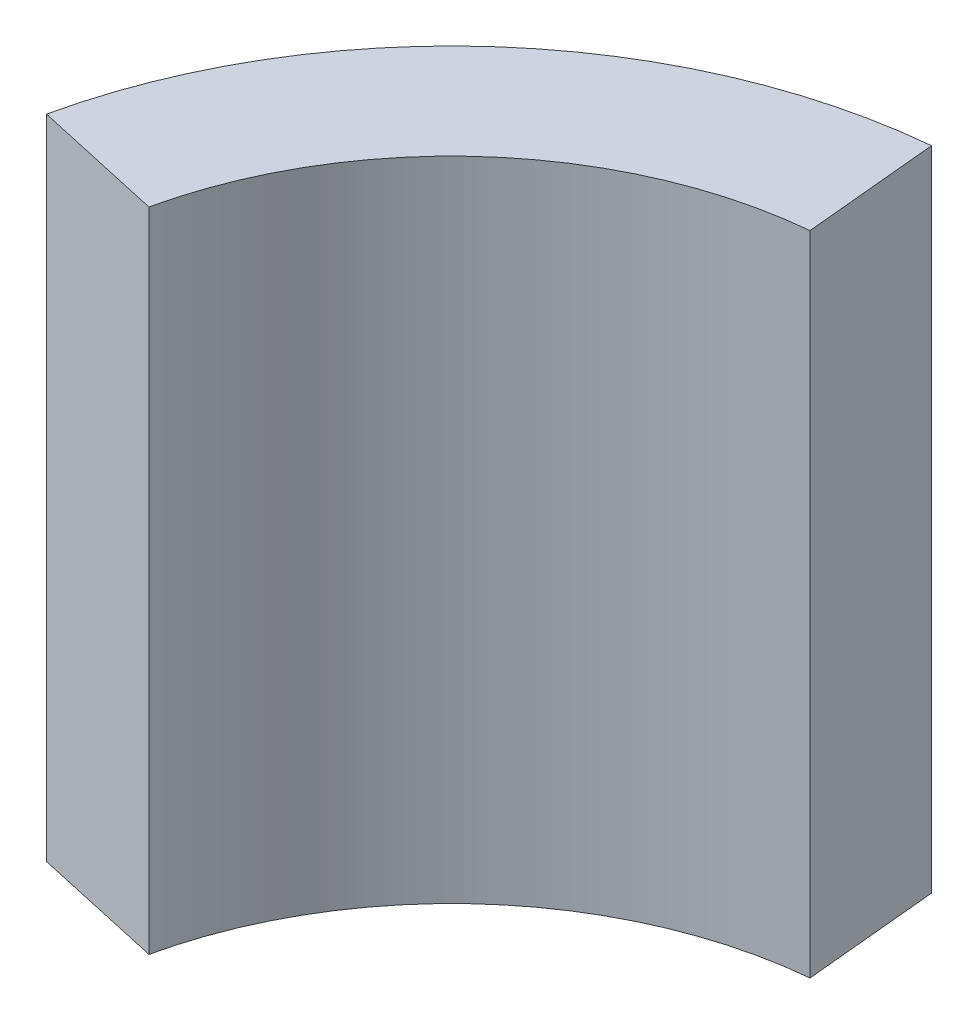
ISO-10303-21;
HEADER;
FILE_DESCRIPTION(('STEP AP214'),'2;1');
FILE_NAME('part.step','',(''),(''),'','','');
FILE_SCHEMA(('AUTOMOTIVE_DESIGN { 1 0 10303 214 1 1 1 1 }'));
ENDSEC;
DATA;
#1=APPLICATION_CONTEXT('core data for automotive mechanical design processes');
#2=APPLICATION_PROTOCOL_DEFINITION('international standard','automotive_design',2000,#1);
#3=PRODUCT_CONTEXT('',#1,'mechanical');
#4=PRODUCT('Part','Part','',(#3));
#5=PRODUCT_RELATED_PRODUCT_CATEGORY('part','',(#4));
#6=PRODUCT_DEFINITION_FORMATION('','',#4);
#7=PRODUCT_DEFINITION_CONTEXT('part definition',#1,'design');
#8=PRODUCT_DEFINITION('design','',#6,#7);
#9=PRODUCT_DEFINITION_SHAPE('','',#8);
#10=(LENGTH_UNIT() NAMED_UNIT(*) SI_UNIT(.MILLI.,.METRE.));
#11=(NAMED_UNIT(*) PLANE_ANGLE_UNIT() SI_UNIT($,.RADIAN.));
#12=(NAMED_UNIT(*) SI_UNIT($,.STERADIAN.) SOLID_ANGLE_UNIT());
#13=UNCERTAINTY_MEASURE_WITH_UNIT(LENGTH_MEASURE(1.E-05),#10,'distance_accuracy_value','');
#14=(GEOMETRIC_REPRESENTATION_CONTEXT(3) GLOBAL_UNCERTAINTY_ASSIGNED_CONTEXT((#13)) GLOBAL_UNIT_ASSIGNED_CONTEXT((#10,
#11,#12)) REPRESENTATION_CONTEXT('',''));
#15=CARTESIAN_POINT('',(0.,0.,0.));
#16=DIRECTION('',(0.,0.,1.));
#17=DIRECTION('',(1.,0.,0.));
#18=AXIS2_PLACEMENT_3D('',#15,#16,#17);
#19=CARTESIAN_POINT('',(-28.4392059626928,48.,-2.1100167731214));
#20=DIRECTION('',(0.,-1.,0.));
#21=DIRECTION('',(0.,0.,-1.));
#22=AXIS2_PLACEMENT_3D('',#19,#20,#21);
#23=CYLINDRICAL_SURFACE('',#22,29.522);
#24=CARTESIAN_POINT('',(-28.4392059626928,0.,-2.1100167731214));
#25=DIRECTION('',(0.,1.,0.));
#26=DIRECTION('',(0.,0.,1.));
#27=AXIS2_PLACEMENT_3D('',#24,#25,#26);
#28=CIRCLE('',#27,29.522);
#29=CARTESIAN_POINT('',(-31.2353905359296,0.,-31.4992977413995));
#30=VERTEX_POINT('',#29);
#31=CARTESIAN_POINT('',(-57.2610189937154,0.,-8.50154066064409));
#32=VERTEX_POINT('',#31);
#33=EDGE_CURVE('E98',#30,#32,#28,.T.);
#34=ORIENTED_EDGE('',*,*,#33,.F.);
#35=DIRECTION('',(0.,-1.,0.));
#36=VECTOR('',#35,1.);
#37=CARTESIAN_POINT('',(-31.2353905359296,48.,-31.4992977413995));
#38=LINE('',#37,#36);
#39=CARTESIAN_POINT('',(-31.2353905359296,48.,-31.4992977413995));
#40=VERTEX_POINT('',#39);
#41=EDGE_CURVE('E11',#40,#30,#38,.T.);
#42=ORIENTED_EDGE('',*,*,#41,.F.);
#43=CARTESIAN_POINT('',(-28.4392059626928,48.,-2.1100167731214));
#44=DIRECTION('',(0.,1.,0.));
#45=DIRECTION('',(0.,0.,1.));
#46=AXIS2_PLACEMENT_3D('',#43,#44,#45);
#47=CIRCLE('',#46,29.522);
#48=CARTESIAN_POINT('',(-57.2610189937154,48.,-8.50154066064409));
#49=VERTEX_POINT('',#48);
#50=EDGE_CURVE('E86',#40,#49,#47,.T.);
#51=ORIENTED_EDGE('',*,*,#50,.T.);
#52=DIRECTION('',(0.,-1.,0.));
#53=VECTOR('',#52,1.);
#54=CARTESIAN_POINT('',(-57.2610189937154,48.,-8.50154066064409));
#55=LINE('',#54,#53);
#56=EDGE_CURVE('E75',#49,#32,#55,.T.);
#57=ORIENTED_EDGE('',*,*,#56,.T.);
#58=EDGE_LOOP('',(#34,#42,#51,#57));
#59=FACE_BOUND('',#58,.T.);
#60=ADVANCED_FACE('F36',(#59),#23,.F.);
#61=CARTESIAN_POINT('',(-31.1217507617976,48.,-30.3048836858365));
#62=DIRECTION('',(-0.995504431581413,0.,0.0947149761218784));
#63=DIRECTION('',(0.0947149761218784,0.,0.995504431581413));
#64=AXIS2_PLACEMENT_3D('',#61,#62,#63);
#65=PLANE('',#64);
#66=DIRECTION('',(-0.0947149761218784,0.,-0.995504431581413));
#67=VECTOR('',#66,1.);
#68=CARTESIAN_POINT('',(-31.1217507617976,0.,-30.3048836858365));
#69=LINE('',#68,#67);
#70=CARTESIAN_POINT('',(-32.1825376380945,0.,-41.4543141091525));
#71=VERTEX_POINT('',#70);
#72=EDGE_CURVE('E91',#30,#71,#69,.T.);
#73=ORIENTED_EDGE('',*,*,#72,.T.);
#74=DIRECTION('',(0.,-1.,0.));
#75=VECTOR('',#74,1.);
#76=CARTESIAN_POINT('',(-32.1825376380945,48.,-41.4543141091525));
#77=LINE('',#76,#75);
#78=CARTESIAN_POINT('',(-32.1825376380945,48.,-41.4543141091525));
#79=VERTEX_POINT('',#78);
#80=EDGE_CURVE('E44',#79,#71,#77,.T.);
#81=ORIENTED_EDGE('',*,*,#80,.F.);
#82=DIRECTION('',(-0.0947149761218784,0.,-0.995504431581413));
#83=VECTOR('',#82,1.);
#84=CARTESIAN_POINT('',(-31.1217507617976,48.,-30.3048836858365));
#85=LINE('',#84,#83);
#86=EDGE_CURVE('E81',#40,#79,#85,.T.);
#87=ORIENTED_EDGE('',*,*,#86,.F.);
#88=ORIENTED_EDGE('',*,*,#41,.T.);
#89=EDGE_LOOP('',(#73,#81,#87,#88));
#90=FACE_BOUND('',#89,.T.);
#91=ADVANCED_FACE('F89',(#90),#65,.F.);
#92=CARTESIAN_POINT('',(-28.4392123518056,48.,-2.10998796419189));
#93=DIRECTION('',(0.,-1.,0.));
#94=DIRECTION('',(0.,0.,-1.));
#95=AXIS2_PLACEMENT_3D('',#92,#93,#94);
#96=CYLINDRICAL_SURFACE('',#95,39.522);
#97=CARTESIAN_POINT('',(-28.4392123518056,0.,-2.10998796419189));
#98=DIRECTION('',(0.,1.,0.));
#99=DIRECTION('',(0.,0.,1.));
#100=AXIS2_PLACEMENT_3D('',#97,#98,#99);
#101=CIRCLE('',#100,39.522);
#102=CARTESIAN_POINT('',(-67.0235982334063,0.,-10.6676541261621));
#103=VERTEX_POINT('',#102);
#104=EDGE_CURVE('E68',#71,#103,#101,.T.);
#105=ORIENTED_EDGE('',*,*,#104,.T.);
#106=DIRECTION('',(0.,-1.,0.));
#107=VECTOR('',#106,1.);
#108=CARTESIAN_POINT('',(-67.0235982334063,48.,-10.6676541261621));
#109=LINE('',#108,#107);
#110=CARTESIAN_POINT('',(-67.0235982334063,48.,-10.6676541261621));
#111=VERTEX_POINT('',#110);
#112=EDGE_CURVE('E92',#111,#103,#109,.T.);
#113=ORIENTED_EDGE('',*,*,#112,.F.);
#114=CARTESIAN_POINT('',(-28.4392123518056,48.,-2.10998796419189));
#115=DIRECTION('',(0.,1.,0.));
#116=DIRECTION('',(0.,0.,1.));
#117=AXIS2_PLACEMENT_3D('',#114,#115,#116);
#118=CIRCLE('',#117,39.522);
#119=EDGE_CURVE('E85',#79,#111,#118,.T.);
#120=ORIENTED_EDGE('',*,*,#119,.F.);
#121=ORIENTED_EDGE('',*,*,#80,.T.);
#122=EDGE_LOOP('',(#105,#113,#120,#121));
#123=FACE_BOUND('',#122,.T.);
#124=ADVANCED_FACE('F93',(#123),#96,.T.);
#125=CARTESIAN_POINT('',(-89.194543440221,48.,-15.5869261521953));
#126=DIRECTION('',(0.216611345515596,0.,-0.976257919298954));
#127=DIRECTION('',(-0.976257919298954,0.,-0.216611345515596));
#128=AXIS2_PLACEMENT_3D('',#125,#126,#127);
#129=PLANE('',#128);
#130=DIRECTION('',(0.976257919298954,0.,0.216611345515596));
#131=VECTOR('',#130,1.);
#132=CARTESIAN_POINT('',(-89.194543440221,0.,-15.5869261521953));
#133=LINE('',#132,#131);
#134=EDGE_CURVE('E103',#103,#32,#133,.T.);
#135=ORIENTED_EDGE('',*,*,#134,.T.);
#136=ORIENTED_EDGE('',*,*,#56,.F.);
#137=DIRECTION('',(0.976257919298954,0.,0.216611345515596));
#138=VECTOR('',#137,1.);
#139=CARTESIAN_POINT('',(-89.194543440221,48.,-15.5869261521953));
#140=LINE('',#139,#138);
#141=EDGE_CURVE('E52',#111,#49,#140,.T.);
#142=ORIENTED_EDGE('',*,*,#141,.F.);
#143=ORIENTED_EDGE('',*,*,#112,.T.);
#144=EDGE_LOOP('',(#135,#136,#142,#143));
#145=FACE_BOUND('',#144,.T.);
#146=ADVANCED_FACE('F108',(#145),#129,.F.);
#147=CARTESIAN_POINT('',(-87.1108754130103,48.,-24.9779273848983));
#148=DIRECTION('',(0.,1.,0.));
#149=DIRECTION('',(0.,0.,1.));
#150=AXIS2_PLACEMENT_3D('',#147,#148,#149);
#151=PLANE('',#150);
#152=ORIENTED_EDGE('',*,*,#50,.F.);
#153=ORIENTED_EDGE('',*,*,#86,.T.);
#154=ORIENTED_EDGE('',*,*,#119,.T.);
#155=ORIENTED_EDGE('',*,*,#141,.T.);
#156=EDGE_LOOP('',(#152,#153,#154,#155));
#157=FACE_BOUND('',#156,.T.);
#158=ADVANCED_FACE('F83',(#157),#151,.T.);
#159=CARTESIAN_POINT('',(-87.1108754130103,0.,-24.9779273848983));
#160=DIRECTION('',(0.,1.,0.));
#161=DIRECTION('',(0.,0.,1.));
#162=AXIS2_PLACEMENT_3D('',#159,#160,#161);
#163=PLANE('',#162);
#164=ORIENTED_EDGE('',*,*,#33,.T.);
#165=ORIENTED_EDGE('',*,*,#134,.F.);
#166=ORIENTED_EDGE('',*,*,#104,.F.);
#167=ORIENTED_EDGE('',*,*,#72,.F.);
#168=EDGE_LOOP('',(#164,#165,#166,#167));
#169=FACE_BOUND('',#168,.T.);
#170=ADVANCED_FACE('F110',(#169),#163,.F.);
#171=CLOSED_SHELL('',(#60,#91,#124,#146,#158,#170));
#172=MANIFOLD_SOLID_BREP('B2',#171);
#173=ADVANCED_BREP_SHAPE_REPRESENTATION('',(#18,#172),#14);
#174=SHAPE_DEFINITION_REPRESENTATION(#9,#173);
ENDSEC;
END-ISO-10303-21;
